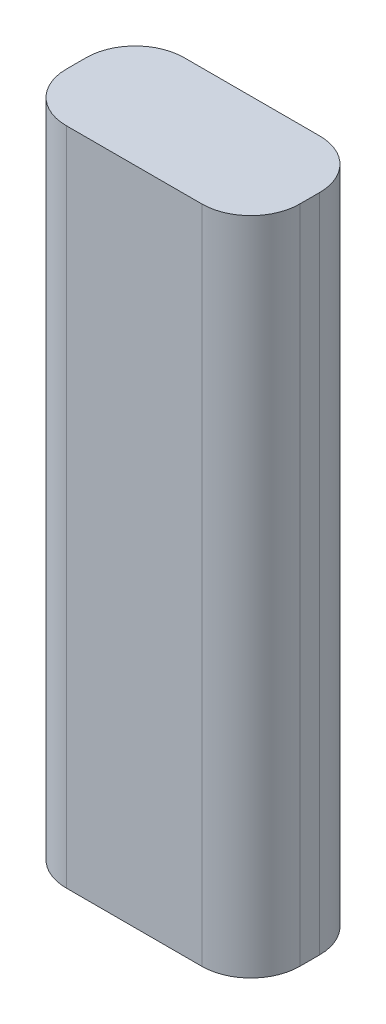
ISO-10303-21;
HEADER;
FILE_DESCRIPTION(('STEP AP214'),'2;1');
FILE_NAME('part.step','',(''),(''),'','','');
FILE_SCHEMA(('AUTOMOTIVE_DESIGN { 1 0 10303 214 1 1 1 1 }'));
ENDSEC;
DATA;
#1=APPLICATION_CONTEXT('core data for automotive mechanical design processes');
#2=APPLICATION_PROTOCOL_DEFINITION('international standard','automotive_design',2000,#1);
#3=PRODUCT_CONTEXT('',#1,'mechanical');
#4=PRODUCT('Part','Part','',(#3));
#5=PRODUCT_RELATED_PRODUCT_CATEGORY('part','',(#4));
#6=PRODUCT_DEFINITION_FORMATION('','',#4);
#7=PRODUCT_DEFINITION_CONTEXT('part definition',#1,'design');
#8=PRODUCT_DEFINITION('design','',#6,#7);
#9=PRODUCT_DEFINITION_SHAPE('','',#8);
#10=(LENGTH_UNIT() NAMED_UNIT(*) SI_UNIT(.MILLI.,.METRE.));
#11=(NAMED_UNIT(*) PLANE_ANGLE_UNIT() SI_UNIT($,.RADIAN.));
#12=(NAMED_UNIT(*) SI_UNIT($,.STERADIAN.) SOLID_ANGLE_UNIT());
#13=UNCERTAINTY_MEASURE_WITH_UNIT(LENGTH_MEASURE(1.E-05),#10,'distance_accuracy_value','');
#14=(GEOMETRIC_REPRESENTATION_CONTEXT(3) GLOBAL_UNCERTAINTY_ASSIGNED_CONTEXT((#13)) GLOBAL_UNIT_ASSIGNED_CONTEXT((#10,
#11,#12)) REPRESENTATION_CONTEXT('',''));
#15=CARTESIAN_POINT('',(0.,0.,0.));
#16=DIRECTION('',(0.,0.,1.));
#17=DIRECTION('',(1.,0.,0.));
#18=AXIS2_PLACEMENT_3D('',#15,#16,#17);
#19=CARTESIAN_POINT('',(-23.835,-67.395,24.06));
#20=DIRECTION('',(1.,0.,0.));
#21=DIRECTION('',(0.,0.,-1.));
#22=AXIS2_PLACEMENT_3D('',#19,#20,#21);
#23=PLANE('',#22);
#24=DIRECTION('',(0.,0.,-1.));
#25=VECTOR('',#24,1.);
#26=CARTESIAN_POINT('',(-23.835,-67.395,24.06));
#27=LINE('',#26,#25);
#28=CARTESIAN_POINT('',(-23.835,-67.395,14.06));
#29=VERTEX_POINT('',#28);
#30=CARTESIAN_POINT('',(-23.835,-67.395,10.));
#31=VERTEX_POINT('',#30);
#32=EDGE_CURVE('E132',#29,#31,#27,.T.);
#33=ORIENTED_EDGE('',*,*,#32,.F.);
#34=DIRECTION('',(0.,-1.,0.));
#35=VECTOR('',#34,1.);
#36=CARTESIAN_POINT('',(-23.835,67.395,14.06));
#37=LINE('',#36,#35);
#38=CARTESIAN_POINT('',(-23.835,67.395,14.06));
#39=VERTEX_POINT('',#38);
#40=EDGE_CURVE('E11',#29,#39,#37,.F.);
#41=ORIENTED_EDGE('',*,*,#40,.T.);
#42=DIRECTION('',(0.,0.,-1.));
#43=VECTOR('',#42,1.);
#44=CARTESIAN_POINT('',(-23.835,67.395,24.06));
#45=LINE('',#44,#43);
#46=CARTESIAN_POINT('',(-23.835,67.395,10.));
#47=VERTEX_POINT('',#46);
#48=EDGE_CURVE('E127',#39,#47,#45,.T.);
#49=ORIENTED_EDGE('',*,*,#48,.T.);
#50=DIRECTION('',(0.,-1.,0.));
#51=VECTOR('',#50,1.);
#52=CARTESIAN_POINT('',(-23.835,-67.395,10.));
#53=LINE('',#52,#51);
#54=EDGE_CURVE('E47',#47,#31,#53,.T.);
#55=ORIENTED_EDGE('',*,*,#54,.T.);
#56=EDGE_LOOP('',(#33,#41,#49,#55));
#57=FACE_BOUND('',#56,.T.);
#58=ADVANCED_FACE('F39',(#57),#23,.F.);
#59=CARTESIAN_POINT('',(23.835,-67.395,24.06));
#60=DIRECTION('',(0.,1.,0.));
#61=DIRECTION('',(0.,0.,1.));
#62=AXIS2_PLACEMENT_3D('',#59,#60,#61);
#63=PLANE('',#62);
#64=DIRECTION('',(1.,0.,0.));
#65=VECTOR('',#64,1.);
#66=CARTESIAN_POINT('',(23.835,-67.395,0.));
#67=LINE('',#66,#65);
#68=CARTESIAN_POINT('',(-13.835,-67.395,0.));
#69=VERTEX_POINT('',#68);
#70=CARTESIAN_POINT('',(13.835,-67.395,0.));
#71=VERTEX_POINT('',#70);
#72=EDGE_CURVE('E163',#69,#71,#67,.T.);
#73=ORIENTED_EDGE('',*,*,#72,.T.);
#74=CARTESIAN_POINT('',(13.835,-67.395,10.));
#75=DIRECTION('',(0.,1.,0.));
#76=DIRECTION('',(0.,0.,1.));
#77=AXIS2_PLACEMENT_3D('',#74,#75,#76);
#78=CIRCLE('',#77,10.);
#79=CARTESIAN_POINT('',(23.835,-67.395,10.));
#80=VERTEX_POINT('',#79);
#81=EDGE_CURVE('E149',#71,#80,#78,.F.);
#82=ORIENTED_EDGE('',*,*,#81,.T.);
#83=DIRECTION('',(0.,0.,-1.));
#84=VECTOR('',#83,1.);
#85=CARTESIAN_POINT('',(23.835,-67.395,24.06));
#86=LINE('',#85,#84);
#87=CARTESIAN_POINT('',(23.835,-67.395,14.06));
#88=VERTEX_POINT('',#87);
#89=EDGE_CURVE('E126',#88,#80,#86,.T.);
#90=ORIENTED_EDGE('',*,*,#89,.F.);
#91=CARTESIAN_POINT('',(13.835,-67.395,14.06));
#92=DIRECTION('',(0.,1.,0.));
#93=DIRECTION('',(0.,0.,1.));
#94=AXIS2_PLACEMENT_3D('',#91,#92,#93);
#95=CIRCLE('',#94,10.);
#96=CARTESIAN_POINT('',(13.835,-67.395,24.06));
#97=VERTEX_POINT('',#96);
#98=EDGE_CURVE('E131',#88,#97,#95,.F.);
#99=ORIENTED_EDGE('',*,*,#98,.T.);
#100=DIRECTION('',(1.,0.,0.));
#101=VECTOR('',#100,1.);
#102=CARTESIAN_POINT('',(23.835,-67.395,24.06));
#103=LINE('',#102,#101);
#104=CARTESIAN_POINT('',(-13.835,-67.395,24.06));
#105=VERTEX_POINT('',#104);
#106=EDGE_CURVE('E173',#105,#97,#103,.T.);
#107=ORIENTED_EDGE('',*,*,#106,.F.);
#108=CARTESIAN_POINT('',(-13.835,-67.395,14.06));
#109=DIRECTION('',(0.,1.,0.));
#110=DIRECTION('',(0.,0.,1.));
#111=AXIS2_PLACEMENT_3D('',#108,#109,#110);
#112=CIRCLE('',#111,10.);
#113=EDGE_CURVE('E62',#105,#29,#112,.F.);
#114=ORIENTED_EDGE('',*,*,#113,.T.);
#115=ORIENTED_EDGE('',*,*,#32,.T.);
#116=CARTESIAN_POINT('',(-13.835,-67.395,10.));
#117=DIRECTION('',(0.,1.,0.));
#118=DIRECTION('',(0.,0.,1.));
#119=AXIS2_PLACEMENT_3D('',#116,#117,#118);
#120=CIRCLE('',#119,10.);
#121=EDGE_CURVE('E54',#31,#69,#120,.F.);
#122=ORIENTED_EDGE('',*,*,#121,.T.);
#123=EDGE_LOOP('',(#73,#82,#90,#99,#107,#114,#115,#122));
#124=FACE_BOUND('',#123,.T.);
#125=ADVANCED_FACE('F161',(#124),#63,.F.);
#126=CARTESIAN_POINT('',(23.835,-67.395,24.06));
#127=DIRECTION('',(-1.,0.,0.));
#128=DIRECTION('',(0.,0.,1.));
#129=AXIS2_PLACEMENT_3D('',#126,#127,#128);
#130=PLANE('',#129);
#131=ORIENTED_EDGE('',*,*,#89,.T.);
#132=DIRECTION('',(0.,1.,0.));
#133=VECTOR('',#132,1.);
#134=CARTESIAN_POINT('',(23.835,-67.395,10.));
#135=LINE('',#134,#133);
#136=CARTESIAN_POINT('',(23.835,67.395,10.));
#137=VERTEX_POINT('',#136);
#138=EDGE_CURVE('E125',#80,#137,#135,.T.);
#139=ORIENTED_EDGE('',*,*,#138,.T.);
#140=DIRECTION('',(0.,0.,-1.));
#141=VECTOR('',#140,1.);
#142=CARTESIAN_POINT('',(23.835,67.395,24.06));
#143=LINE('',#142,#141);
#144=CARTESIAN_POINT('',(23.835,67.395,14.06));
#145=VERTEX_POINT('',#144);
#146=EDGE_CURVE('E108',#145,#137,#143,.T.);
#147=ORIENTED_EDGE('',*,*,#146,.F.);
#148=DIRECTION('',(0.,1.,0.));
#149=VECTOR('',#148,1.);
#150=CARTESIAN_POINT('',(23.835,-67.395,14.06));
#151=LINE('',#150,#149);
#152=EDGE_CURVE('E122',#145,#88,#151,.F.);
#153=ORIENTED_EDGE('',*,*,#152,.T.);
#154=EDGE_LOOP('',(#131,#139,#147,#153));
#155=FACE_BOUND('',#154,.T.);
#156=ADVANCED_FACE('F121',(#155),#130,.F.);
#157=CARTESIAN_POINT('',(23.835,67.395,24.06));
#158=DIRECTION('',(0.,-1.,0.));
#159=DIRECTION('',(0.,0.,-1.));
#160=AXIS2_PLACEMENT_3D('',#157,#158,#159);
#161=PLANE('',#160);
#162=ORIENTED_EDGE('',*,*,#146,.T.);
#163=CARTESIAN_POINT('',(13.835,67.395,10.));
#164=DIRECTION('',(0.,-1.,0.));
#165=DIRECTION('',(0.,0.,-1.));
#166=AXIS2_PLACEMENT_3D('',#163,#164,#165);
#167=CIRCLE('',#166,10.);
#168=CARTESIAN_POINT('',(13.835,67.395,0.));
#169=VERTEX_POINT('',#168);
#170=EDGE_CURVE('E115',#137,#169,#167,.F.);
#171=ORIENTED_EDGE('',*,*,#170,.T.);
#172=DIRECTION('',(-1.,0.,0.));
#173=VECTOR('',#172,1.);
#174=CARTESIAN_POINT('',(23.835,67.395,0.));
#175=LINE('',#174,#173);
#176=CARTESIAN_POINT('',(-13.835,67.395,0.));
#177=VERTEX_POINT('',#176);
#178=EDGE_CURVE('E170',#169,#177,#175,.T.);
#179=ORIENTED_EDGE('',*,*,#178,.T.);
#180=CARTESIAN_POINT('',(-13.835,67.395,10.));
#181=DIRECTION('',(0.,-1.,0.));
#182=DIRECTION('',(0.,0.,-1.));
#183=AXIS2_PLACEMENT_3D('',#180,#181,#182);
#184=CIRCLE('',#183,10.);
#185=EDGE_CURVE('E134',#177,#47,#184,.F.);
#186=ORIENTED_EDGE('',*,*,#185,.T.);
#187=ORIENTED_EDGE('',*,*,#48,.F.);
#188=CARTESIAN_POINT('',(-13.835,67.395,14.06));
#189=DIRECTION('',(0.,-1.,0.));
#190=DIRECTION('',(0.,0.,-1.));
#191=AXIS2_PLACEMENT_3D('',#188,#189,#190);
#192=CIRCLE('',#191,10.);
#193=CARTESIAN_POINT('',(-13.835,67.395,24.06));
#194=VERTEX_POINT('',#193);
#195=EDGE_CURVE('E116',#39,#194,#192,.F.);
#196=ORIENTED_EDGE('',*,*,#195,.T.);
#197=DIRECTION('',(-1.,0.,0.));
#198=VECTOR('',#197,1.);
#199=CARTESIAN_POINT('',(23.835,67.395,24.06));
#200=LINE('',#199,#198);
#201=CARTESIAN_POINT('',(13.835,67.395,24.06));
#202=VERTEX_POINT('',#201);
#203=EDGE_CURVE('E110',#202,#194,#200,.T.);
#204=ORIENTED_EDGE('',*,*,#203,.F.);
#205=CARTESIAN_POINT('',(13.835,67.395,14.06));
#206=DIRECTION('',(0.,-1.,0.));
#207=DIRECTION('',(0.,0.,-1.));
#208=AXIS2_PLACEMENT_3D('',#205,#206,#207);
#209=CIRCLE('',#208,10.);
#210=EDGE_CURVE('E105',#202,#145,#209,.F.);
#211=ORIENTED_EDGE('',*,*,#210,.T.);
#212=EDGE_LOOP('',(#162,#171,#179,#186,#187,#196,#204,#211));
#213=FACE_BOUND('',#212,.T.);
#214=ADVANCED_FACE('F107',(#213),#161,.F.);
#215=CARTESIAN_POINT('',(0.,0.,24.06));
#216=DIRECTION('',(0.,0.,1.));
#217=DIRECTION('',(1.,0.,0.));
#218=AXIS2_PLACEMENT_3D('',#215,#216,#217);
#219=PLANE('',#218);
#220=ORIENTED_EDGE('',*,*,#106,.T.);
#221=DIRECTION('',(0.,1.,0.));
#222=VECTOR('',#221,1.);
#223=CARTESIAN_POINT('',(13.835,67.395,24.06));
#224=LINE('',#223,#222);
#225=EDGE_CURVE('E154',#97,#202,#224,.T.);
#226=ORIENTED_EDGE('',*,*,#225,.T.);
#227=ORIENTED_EDGE('',*,*,#203,.T.);
#228=DIRECTION('',(0.,-1.,0.));
#229=VECTOR('',#228,1.);
#230=CARTESIAN_POINT('',(-13.835,-67.395,24.06));
#231=LINE('',#230,#229);
#232=EDGE_CURVE('E151',#194,#105,#231,.T.);
#233=ORIENTED_EDGE('',*,*,#232,.T.);
#234=EDGE_LOOP('',(#220,#226,#227,#233));
#235=FACE_BOUND('',#234,.T.);
#236=ADVANCED_FACE('F189',(#235),#219,.T.);
#237=CARTESIAN_POINT('',(0.,0.,0.));
#238=DIRECTION('',(0.,0.,1.));
#239=DIRECTION('',(1.,0.,0.));
#240=AXIS2_PLACEMENT_3D('',#237,#238,#239);
#241=PLANE('',#240);
#242=ORIENTED_EDGE('',*,*,#178,.F.);
#243=DIRECTION('',(0.,1.,0.));
#244=VECTOR('',#243,1.);
#245=CARTESIAN_POINT('',(13.835,0.,0.));
#246=LINE('',#245,#244);
#247=EDGE_CURVE('E144',#169,#71,#246,.F.);
#248=ORIENTED_EDGE('',*,*,#247,.T.);
#249=ORIENTED_EDGE('',*,*,#72,.F.);
#250=DIRECTION('',(0.,-1.,0.));
#251=VECTOR('',#250,1.);
#252=CARTESIAN_POINT('',(-13.835,0.,0.));
#253=LINE('',#252,#251);
#254=EDGE_CURVE('E142',#69,#177,#253,.F.);
#255=ORIENTED_EDGE('',*,*,#254,.T.);
#256=EDGE_LOOP('',(#242,#248,#249,#255));
#257=FACE_BOUND('',#256,.T.);
#258=ADVANCED_FACE('F167',(#257),#241,.F.);
#259=CARTESIAN_POINT('',(13.835,-67.395,10.));
#260=DIRECTION('',(0.,1.,0.));
#261=DIRECTION('',(0.,0.,1.));
#262=AXIS2_PLACEMENT_3D('',#259,#260,#261);
#263=CYLINDRICAL_SURFACE('',#262,10.);
#264=ORIENTED_EDGE('',*,*,#81,.F.);
#265=ORIENTED_EDGE('',*,*,#247,.F.);
#266=ORIENTED_EDGE('',*,*,#170,.F.);
#267=ORIENTED_EDGE('',*,*,#138,.F.);
#268=EDGE_LOOP('',(#264,#265,#266,#267));
#269=FACE_BOUND('',#268,.T.);
#270=ADVANCED_FACE('F180',(#269),#263,.T.);
#271=CARTESIAN_POINT('',(13.835,0.,14.06));
#272=DIRECTION('',(0.,-1.,0.));
#273=DIRECTION('',(0.,0.,-1.));
#274=AXIS2_PLACEMENT_3D('',#271,#272,#273);
#275=CYLINDRICAL_SURFACE('',#274,10.);
#276=ORIENTED_EDGE('',*,*,#98,.F.);
#277=ORIENTED_EDGE('',*,*,#152,.F.);
#278=ORIENTED_EDGE('',*,*,#210,.F.);
#279=ORIENTED_EDGE('',*,*,#225,.F.);
#280=EDGE_LOOP('',(#276,#277,#278,#279));
#281=FACE_BOUND('',#280,.T.);
#282=ADVANCED_FACE('F130',(#281),#275,.T.);
#283=CARTESIAN_POINT('',(-13.835,0.,14.06));
#284=DIRECTION('',(0.,1.,0.));
#285=DIRECTION('',(0.,0.,1.));
#286=AXIS2_PLACEMENT_3D('',#283,#284,#285);
#287=CYLINDRICAL_SURFACE('',#286,10.);
#288=ORIENTED_EDGE('',*,*,#195,.F.);
#289=ORIENTED_EDGE('',*,*,#40,.F.);
#290=ORIENTED_EDGE('',*,*,#113,.F.);
#291=ORIENTED_EDGE('',*,*,#232,.F.);
#292=EDGE_LOOP('',(#288,#289,#290,#291));
#293=FACE_BOUND('',#292,.T.);
#294=ADVANCED_FACE('F187',(#293),#287,.T.);
#295=CARTESIAN_POINT('',(-13.835,-67.395,10.));
#296=DIRECTION('',(0.,-1.,0.));
#297=DIRECTION('',(0.,0.,-1.));
#298=AXIS2_PLACEMENT_3D('',#295,#296,#297);
#299=CYLINDRICAL_SURFACE('',#298,10.);
#300=ORIENTED_EDGE('',*,*,#185,.F.);
#301=ORIENTED_EDGE('',*,*,#254,.F.);
#302=ORIENTED_EDGE('',*,*,#121,.F.);
#303=ORIENTED_EDGE('',*,*,#54,.F.);
#304=EDGE_LOOP('',(#300,#301,#302,#303));
#305=FACE_BOUND('',#304,.T.);
#306=ADVANCED_FACE('F41',(#305),#299,.T.);
#307=CLOSED_SHELL('',(#58,#125,#156,#214,#236,#258,#270,#282,#294,#306));
#308=MANIFOLD_SOLID_BREP('B2',#307);
#309=ADVANCED_BREP_SHAPE_REPRESENTATION('',(#18,#308),#14);
#310=SHAPE_DEFINITION_REPRESENTATION(#9,#309);
ENDSEC;
END-ISO-10303-21;
